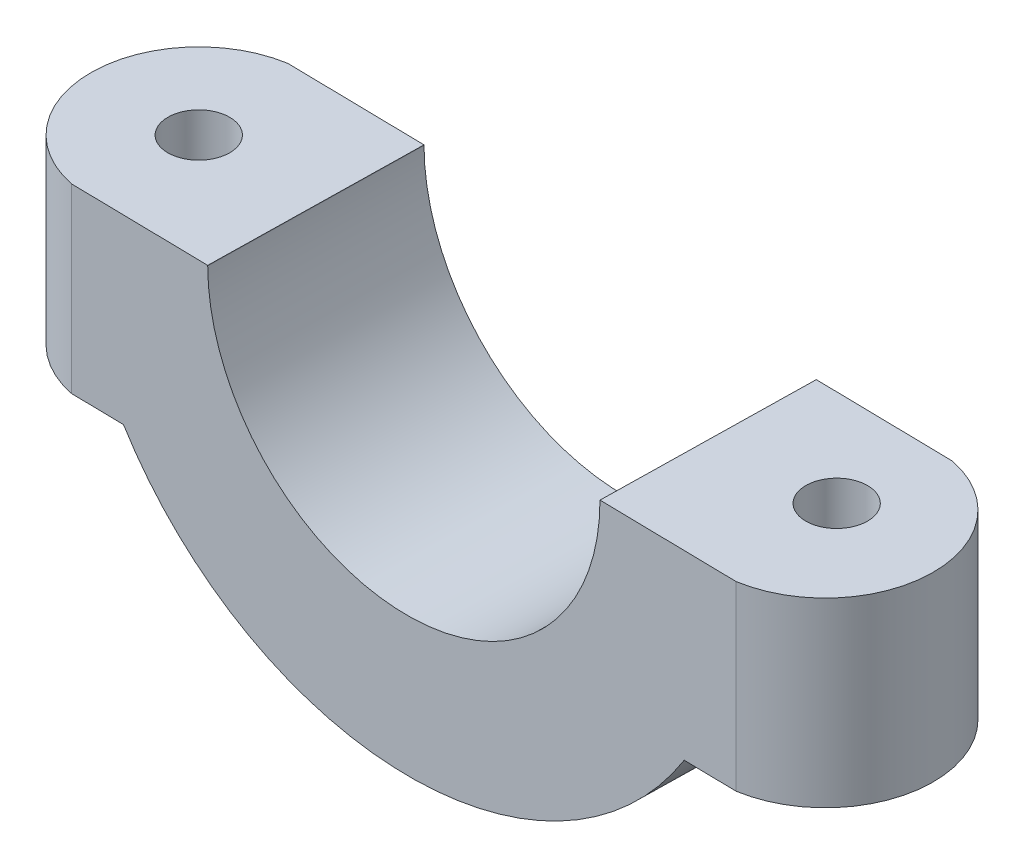
ISO-10303-21;
HEADER;
FILE_DESCRIPTION(('STEP AP214'),'2;1');
FILE_NAME('part.step','',(''),(''),'','','');
FILE_SCHEMA(('AUTOMOTIVE_DESIGN { 1 0 10303 214 1 1 1 1 }'));
ENDSEC;
DATA;
#1=APPLICATION_CONTEXT('core data for automotive mechanical design processes');
#2=APPLICATION_PROTOCOL_DEFINITION('international standard','automotive_design',2000,#1);
#3=PRODUCT_CONTEXT('',#1,'mechanical');
#4=PRODUCT('Part','Part','',(#3));
#5=PRODUCT_RELATED_PRODUCT_CATEGORY('part','',(#4));
#6=PRODUCT_DEFINITION_FORMATION('','',#4);
#7=PRODUCT_DEFINITION_CONTEXT('part definition',#1,'design');
#8=PRODUCT_DEFINITION('design','',#6,#7);
#9=PRODUCT_DEFINITION_SHAPE('','',#8);
#10=(LENGTH_UNIT() NAMED_UNIT(*) SI_UNIT(.MILLI.,.METRE.));
#11=(NAMED_UNIT(*) PLANE_ANGLE_UNIT() SI_UNIT($,.RADIAN.));
#12=(NAMED_UNIT(*) SI_UNIT($,.STERADIAN.) SOLID_ANGLE_UNIT());
#13=UNCERTAINTY_MEASURE_WITH_UNIT(LENGTH_MEASURE(1.E-05),#10,'distance_accuracy_value','');
#14=(GEOMETRIC_REPRESENTATION_CONTEXT(3) GLOBAL_UNCERTAINTY_ASSIGNED_CONTEXT((#13)) GLOBAL_UNIT_ASSIGNED_CONTEXT((#10,
#11,#12)) REPRESENTATION_CONTEXT('',''));
#15=CARTESIAN_POINT('',(0.,0.,0.));
#16=DIRECTION('',(0.,0.,1.));
#17=DIRECTION('',(1.,0.,0.));
#18=AXIS2_PLACEMENT_3D('',#15,#16,#17);
#19=CARTESIAN_POINT('',(-17.5642585339829,10.0010801024383,-0.312946842197242));
#20=DIRECTION('',(0.,-1.,0.));
#21=DIRECTION('',(0.,0.,-1.));
#22=AXIS2_PLACEMENT_3D('',#19,#20,#21);
#23=CYLINDRICAL_SURFACE('',#22,1.7);
#24=CARTESIAN_POINT('',(-17.5642585339829,10.,-0.312946842197242));
#25=DIRECTION('',(0.,1.,0.));
#26=DIRECTION('',(0.,0.,1.));
#27=AXIS2_PLACEMENT_3D('',#24,#25,#26);
#28=CIRCLE('',#27,1.7);
#29=CARTESIAN_POINT('',(-17.5642585339829,10.,1.38705315780276));
#30=VERTEX_POINT('',#29);
#31=EDGE_CURVE('E283',#30,#30,#28,.T.);
#32=ORIENTED_EDGE('',*,*,#31,.T.);
#33=EDGE_LOOP('',(#32));
#34=FACE_BOUND('',#33,.T.);
#35=CARTESIAN_POINT('',(-17.5642585339829,2.4,-0.312946842197242));
#36=DIRECTION('',(0.,-1.,0.));
#37=DIRECTION('',(0.,0.,-1.));
#38=AXIS2_PLACEMENT_3D('',#35,#36,#37);
#39=CIRCLE('',#38,1.7);
#40=CARTESIAN_POINT('',(-17.5642585339829,2.4,-2.01294684219724));
#41=VERTEX_POINT('',#40);
#42=EDGE_CURVE('E277',#41,#41,#39,.F.);
#43=ORIENTED_EDGE('',*,*,#42,.F.);
#44=EDGE_LOOP('',(#43));
#45=FACE_BOUND('',#44,.T.);
#46=ADVANCED_FACE('F35',(#34,#45),#23,.F.);
#47=CARTESIAN_POINT('',(0.851328214918512,10.,-47.5096137591291));
#48=DIRECTION('',(-0.0179161963788297,0.,0.99983949207226));
#49=DIRECTION('',(0.99983949207226,0.,0.0179161963788297));
#50=AXIS2_PLACEMENT_3D('',#47,#48,#49);
#51=CYLINDRICAL_SURFACE('',#50,18.6341563785991);
#52=CARTESIAN_POINT('',(-0.12045017804225,10.,6.72189801268763));
#53=DIRECTION('',(-0.5,0.,-0.866025403784439));
#54=DIRECTION('',(-0.866025403784439,0.,0.5));
#55=AXIS2_PLACEMENT_3D('',#52,#53,#54);
#56=ELLIPSE('',#55,21.745292275531,18.6341563785991);
#57=CARTESIAN_POINT('',(14.8142585339829,-1.35110478054826,-1.90066008246871));
#58=VERTEX_POINT('',#57);
#59=CARTESIAN_POINT('',(15.7700766746674,0.,-2.45250194328924));
#60=VERTEX_POINT('',#59);
#61=EDGE_CURVE('E281',#58,#60,#56,.F.);
#62=ORIENTED_EDGE('',*,*,#61,.F.);
#63=CARTESIAN_POINT('',(14.8142585339829,10.,-826.731322589581));
#64=DIRECTION('',(-1.,0.,0.));
#65=DIRECTION('',(0.,0.,1.));
#66=AXIS2_PLACEMENT_3D('',#63,#64,#65);
#67=ELLIPSE('',#66,1040.07323790097,18.6341563785991);
#68=CARTESIAN_POINT('',(14.8142585339829,-1.27665178885881,1.27476639807423));
#69=VERTEX_POINT('',#68);
#70=EDGE_CURVE('E11',#69,#58,#67,.F.);
#71=ORIENTED_EDGE('',*,*,#70,.F.);
#72=CARTESIAN_POINT('',(0.129084035860714,10.,-7.20372305151323));
#73=DIRECTION('',(-0.5,0.,0.866025403784438));
#74=DIRECTION('',(0.866025403784438,0.,0.500000000000001));
#75=AXIS2_PLACEMENT_3D('',#72,#73,#74);
#76=ELLIPSE('',#75,21.2999640742331,18.6341563785991);
#77=CARTESIAN_POINT('',(15.6941841409632,0.,1.78279168413117));
#78=VERTEX_POINT('',#77);
#79=EDGE_CURVE('E279',#78,#69,#76,.F.);
#80=ORIENTED_EDGE('',*,*,#79,.F.);
#81=DIRECTION('',(-0.0179161963788297,0.,0.99983949207226));
#82=VECTOR('',#81,1.);
#83=CARTESIAN_POINT('',(16.5724103974162,0.,-47.227906547219));
#84=LINE('',#83,#82);
#85=CARTESIAN_POINT('',(15.6162083568738,0.,6.13434414032025));
#86=VERTEX_POINT('',#85);
#87=EDGE_CURVE('E467',#86,#78,#84,.F.);
#88=ORIENTED_EDGE('',*,*,#87,.F.);
#89=CARTESIAN_POINT('',(-0.104873825623811,10.,5.85263692841008));
#90=DIRECTION('',(-0.0179161963788297,0.,0.99983949207226));
#91=DIRECTION('',(0.99983949207226,0.,0.0179161963788297));
#92=AXIS2_PLACEMENT_3D('',#89,#90,#91);
#93=CIRCLE('',#92,18.6341563785991);
#94=CARTESIAN_POINT('',(-15.8259560081214,0.,5.57092971649992));
#95=VERTEX_POINT('',#94);
#96=EDGE_CURVE('E370',#95,#86,#93,.T.);
#97=ORIENTED_EDGE('',*,*,#96,.F.);
#98=DIRECTION('',(-0.0179161963788297,0.,0.99983949207226));
#99=VECTOR('',#98,1.);
#100=CARTESIAN_POINT('',(-14.8697539675791,0.,-47.7913209710393));
#101=LINE('',#100,#99);
#102=CARTESIAN_POINT('',(-15.7587439972028,0.,1.82006533450991));
#103=VERTEX_POINT('',#102);
#104=EDGE_CURVE('E382',#95,#103,#101,.F.);
#105=ORIENTED_EDGE('',*,*,#104,.T.);
#106=CARTESIAN_POINT('',(0.131782855506878,10.,-7.35433462146697));
#107=DIRECTION('',(0.5,0.,0.866025403784439));
#108=DIRECTION('',(-0.866025403784439,0.,0.5));
#109=AXIS2_PLACEMENT_3D('',#106,#107,#108);
#110=ELLIPSE('',#109,21.745292275531,18.6341563785991);
#111=CARTESIAN_POINT('',(-14.8142585339829,-1.3364909772252,1.27476639807423));
#112=VERTEX_POINT('',#111);
#113=EDGE_CURVE('E276',#112,#103,#110,.F.);
#114=ORIENTED_EDGE('',*,*,#113,.F.);
#115=CARTESIAN_POINT('',(-14.8142585339829,10.,826.731322589581));
#116=DIRECTION('',(1.,0.,0.));
#117=DIRECTION('',(0.,0.,1.));
#118=AXIS2_PLACEMENT_3D('',#115,#116,#117);
#119=ELLIPSE('',#118,1040.07323790097,18.6341563785991);
#120=CARTESIAN_POINT('',(-14.8142585339829,-1.26188472603565,-1.90066008246871));
#121=VERTEX_POINT('',#120);
#122=EDGE_CURVE('E43',#121,#112,#119,.F.);
#123=ORIENTED_EDGE('',*,*,#122,.F.);
#124=CARTESIAN_POINT('',(-0.117983443612844,10.,6.58423829704122));
#125=DIRECTION('',(0.5,0.,-0.866025403784438));
#126=DIRECTION('',(0.866025403784439,0.,0.5));
#127=AXIS2_PLACEMENT_3D('',#124,#125,#126);
#128=ELLIPSE('',#127,21.2999640742331,18.6341563785991);
#129=CARTESIAN_POINT('',(-15.6830835487153,0.,-2.40227643860318));
#130=VERTEX_POINT('',#129);
#131=EDGE_CURVE('E274',#130,#121,#128,.F.);
#132=ORIENTED_EDGE('',*,*,#131,.F.);
#133=CARTESIAN_POINT('',(-15.6162724285387,0.,-6.13076852753603));
#134=VERTEX_POINT('',#133);
#135=EDGE_CURVE('E463',#130,#134,#101,.F.);
#136=ORIENTED_EDGE('',*,*,#135,.T.);
#137=CARTESIAN_POINT('',(0.104809753958984,10.,-5.84906131562587));
#138=DIRECTION('',(-0.0179161963788298,0.,0.99983949207226));
#139=DIRECTION('',(0.99983949207226,0.,0.0179161963788298));
#140=AXIS2_PLACEMENT_3D('',#137,#138,#139);
#141=CIRCLE('',#140,18.6341563785991);
#142=CARTESIAN_POINT('',(15.8258919364566,0.,-5.56735410371571));
#143=VERTEX_POINT('',#142);
#144=EDGE_CURVE('E487',#143,#134,#141,.F.);
#145=ORIENTED_EDGE('',*,*,#144,.F.);
#146=EDGE_CURVE('E469',#60,#143,#84,.F.);
#147=ORIENTED_EDGE('',*,*,#146,.F.);
#148=EDGE_LOOP('',(#62,#71,#80,#88,#97,#105,#114,#123,#132,#136,#145,#147));
#149=FACE_BOUND('',#148,.T.);
#150=ADVANCED_FACE('F457',(#149),#51,.T.);
#151=CARTESIAN_POINT('',(0.851328214918512,10.,-47.5096137591291));
#152=DIRECTION('',(-0.0179161963788297,0.,0.99983949207226));
#153=DIRECTION('',(0.99983949207226,0.,0.0179161963788297));
#154=AXIS2_PLACEMENT_3D('',#151,#152,#153);
#155=CYLINDRICAL_SURFACE('',#154,11.);
#156=CARTESIAN_POINT('',(0.104809753958984,10.,-5.84906131562587));
#157=DIRECTION('',(-0.0179161963788298,0.,0.99983949207226));
#158=DIRECTION('',(0.99983949207226,0.,0.0179161963788298));
#159=AXIS2_PLACEMENT_3D('',#156,#157,#158);
#160=CIRCLE('',#159,11.);
#161=CARTESIAN_POINT('',(-10.8933926230034,9.97345003897609,-6.04613890174059));
#162=VERTEX_POINT('',#161);
#163=CARTESIAN_POINT('',(11.1030441667539,10.,-5.65198315545875));
#164=VERTEX_POINT('',#163);
#165=EDGE_CURVE('E343',#162,#164,#160,.T.);
#166=ORIENTED_EDGE('',*,*,#165,.F.);
#167=DIRECTION('',(-0.0179161963788297,0.,0.99983949207226));
#168=VECTOR('',#167,1.);
#169=CARTESIAN_POINT('',(-10.1468741620439,9.97345003897252,-47.7066913452438));
#170=LINE('',#169,#168);
#171=CARTESIAN_POINT('',(-11.1030762025862,9.97345003897252,5.65555934229536));
#172=VERTEX_POINT('',#171);
#173=EDGE_CURVE('E356',#162,#172,#170,.T.);
#174=ORIENTED_EDGE('',*,*,#173,.T.);
#175=CARTESIAN_POINT('',(-0.104873825623811,10.,5.85263692841008));
#176=DIRECTION('',(0.0179161963788297,0.,-0.99983949207226));
#177=DIRECTION('',(0.99983949207226,0.,0.0179161963788297));
#178=AXIS2_PLACEMENT_3D('',#175,#176,#177);
#179=CIRCLE('',#178,11.);
#180=CARTESIAN_POINT('',(10.8933605871711,10.,6.04971508857721));
#181=VERTEX_POINT('',#180);
#182=EDGE_CURVE('E364',#181,#172,#179,.T.);
#183=ORIENTED_EDGE('',*,*,#182,.F.);
#184=DIRECTION('',(-0.0179161963788297,0.,0.99983949207226));
#185=VECTOR('',#184,1.);
#186=CARTESIAN_POINT('',(11.8495626277134,10.,-47.312535598962));
#187=LINE('',#186,#185);
#188=EDGE_CURVE('E372',#164,#181,#187,.T.);
#189=ORIENTED_EDGE('',*,*,#188,.F.);
#190=EDGE_LOOP('',(#166,#174,#183,#189));
#191=FACE_BOUND('',#190,.T.);
#192=ADVANCED_FACE('F499',(#191),#155,.F.);
#193=CARTESIAN_POINT('',(17.5642585339831,10.,0.316523603086257));
#194=DIRECTION('',(0.,-1.,0.));
#195=DIRECTION('',(0.,0.,-1.));
#196=AXIS2_PLACEMENT_3D('',#193,#194,#195);
#197=CYLINDRICAL_SURFACE('',#196,5.94828404765475);
#198=CARTESIAN_POINT('',(17.5642585339831,0.,0.316523603086257));
#199=DIRECTION('',(0.,1.,0.));
#200=DIRECTION('',(0.,0.,1.));
#201=AXIS2_PLACEMENT_3D('',#198,#199,#200);
#202=CIRCLE('',#201,5.94828404765475);
#203=CARTESIAN_POINT('',(18.5263236589823,0.,6.18649070749529));
#204=VERTEX_POINT('',#203);
#205=CARTESIAN_POINT('',(18.7360072385651,0.,-5.51520753654067));
#206=VERTEX_POINT('',#205);
#207=EDGE_CURVE('E484',#204,#206,#202,.T.);
#208=ORIENTED_EDGE('',*,*,#207,.T.);
#209=DIRECTION('',(0.,-1.,0.));
#210=VECTOR('',#209,1.);
#211=CARTESIAN_POINT('',(18.7360072385651,10.,-5.51520753654067));
#212=LINE('',#211,#210);
#213=CARTESIAN_POINT('',(18.7360072385651,10.,-5.51520753654067));
#214=VERTEX_POINT('',#213);
#215=EDGE_CURVE('E472',#214,#206,#212,.T.);
#216=ORIENTED_EDGE('',*,*,#215,.F.);
#217=CARTESIAN_POINT('',(17.5642585339831,10.,0.316523603086257));
#218=DIRECTION('',(0.,1.,0.));
#219=DIRECTION('',(0.,0.,1.));
#220=AXIS2_PLACEMENT_3D('',#217,#218,#219);
#221=CIRCLE('',#220,5.94828404765475);
#222=CARTESIAN_POINT('',(18.5263236589823,10.,6.18649070749529));
#223=VERTEX_POINT('',#222);
#224=EDGE_CURVE('E480',#223,#214,#221,.T.);
#225=ORIENTED_EDGE('',*,*,#224,.F.);
#226=DIRECTION('',(0.,-1.,0.));
#227=VECTOR('',#226,1.);
#228=CARTESIAN_POINT('',(18.5263236589823,10.,6.18649070749529));
#229=LINE('',#228,#227);
#230=EDGE_CURVE('E475',#223,#204,#229,.T.);
#231=ORIENTED_EDGE('',*,*,#230,.T.);
#232=EDGE_LOOP('',(#208,#216,#225,#231));
#233=FACE_BOUND('',#232,.T.);
#234=ADVANCED_FACE('F37',(#233),#197,.T.);
#235=CARTESIAN_POINT('',(18.7360072385651,10.,-5.51520753654067));
#236=DIRECTION('',(-0.0179161963788298,0.,0.99983949207226));
#237=DIRECTION('',(0.99983949207226,0.,0.0179161963788298));
#238=AXIS2_PLACEMENT_3D('',#235,#236,#237);
#239=PLANE('',#238);
#240=DIRECTION('',(0.,-1.,0.));
#241=VECTOR('',#240,1.);
#242=CARTESIAN_POINT('',(-10.8933926230034,10.,-6.0461389017406));
#243=LINE('',#242,#241);
#244=CARTESIAN_POINT('',(-10.8933926230034,10.,-6.0461389017406));
#245=VERTEX_POINT('',#244);
#246=EDGE_CURVE('E342',#245,#162,#243,.T.);
#247=ORIENTED_EDGE('',*,*,#246,.T.);
#248=ORIENTED_EDGE('',*,*,#165,.T.);
#249=DIRECTION('',(-0.99983949207226,0.,-0.0179161963788298));
#250=VECTOR('',#249,1.);
#251=CARTESIAN_POINT('',(18.7360072385651,10.,-5.51520753654067));
#252=LINE('',#251,#250);
#253=EDGE_CURVE('E489',#214,#164,#252,.T.);
#254=ORIENTED_EDGE('',*,*,#253,.F.);
#255=ORIENTED_EDGE('',*,*,#215,.T.);
#256=DIRECTION('',(-0.99983949207226,0.,-0.0179161963788298));
#257=VECTOR('',#256,1.);
#258=CARTESIAN_POINT('',(18.7360072385651,0.,-5.51520753654067));
#259=LINE('',#258,#257);
#260=EDGE_CURVE('E481',#206,#143,#259,.T.);
#261=ORIENTED_EDGE('',*,*,#260,.T.);
#262=ORIENTED_EDGE('',*,*,#144,.T.);
#263=DIRECTION('',(-0.99983949207226,0.,-0.0179161963788298));
#264=VECTOR('',#263,1.);
#265=CARTESIAN_POINT('',(-10.8933926230034,0.,-6.0461389017406));
#266=LINE('',#265,#264);
#267=CARTESIAN_POINT('',(-18.5263236589821,0.,-6.18291394660628));
#268=VERTEX_POINT('',#267);
#269=EDGE_CURVE('E299',#134,#268,#266,.T.);
#270=ORIENTED_EDGE('',*,*,#269,.T.);
#271=DIRECTION('',(0.,-1.,0.));
#272=VECTOR('',#271,1.);
#273=CARTESIAN_POINT('',(-18.5263236589821,10.,-6.18291394660628));
#274=LINE('',#273,#272);
#275=CARTESIAN_POINT('',(-18.5263236589821,9.96544407338109,-6.18291394660628));
#276=VERTEX_POINT('',#275);
#277=EDGE_CURVE('E334',#276,#268,#274,.T.);
#278=ORIENTED_EDGE('',*,*,#277,.F.);
#279=CARTESIAN_POINT('',(-18.5263236589821,9.96544407338109,-6.18291394660628));
#280=DIRECTION('',(0.,1.,0.));
#281=VECTOR('',#280,1.);
#282=LINE('',#279,#281);
#283=CARTESIAN_POINT('',(-18.5263397292386,10.,-6.18291131270761));
#284=VERTEX_POINT('',#283);
#285=EDGE_CURVE('E498',#276,#284,#282,.T.);
#286=ORIENTED_EDGE('',*,*,#285,.T.);
#287=DIRECTION('',(0.99983949207226,0.,0.0179161963788298));
#288=VECTOR('',#287,1.);
#289=CARTESIAN_POINT('',(-10.8934246588359,10.,-6.046139475793));
#290=LINE('',#289,#288);
#291=EDGE_CURVE('E389',#284,#245,#290,.T.);
#292=ORIENTED_EDGE('',*,*,#291,.T.);
#293=EDGE_LOOP('',(#247,#248,#254,#255,#261,#262,#270,#278,#286,#292));
#294=FACE_BOUND('',#293,.T.);
#295=ADVANCED_FACE('F400',(#294),#239,.F.);
#296=CARTESIAN_POINT('',(10.8933926230035,10.,6.04971566262962));
#297=DIRECTION('',(0.0179161963788297,0.,-0.99983949207226));
#298=DIRECTION('',(-0.99983949207226,0.,-0.0179161963788297));
#299=AXIS2_PLACEMENT_3D('',#296,#297,#298);
#300=PLANE('',#299);
#301=ORIENTED_EDGE('',*,*,#182,.T.);
#302=DIRECTION('',(0.,-1.,0.));
#303=VECTOR('',#302,1.);
#304=CARTESIAN_POINT('',(-11.1030762025862,10.,5.65555934229536));
#305=LINE('',#304,#303);
#306=CARTESIAN_POINT('',(-11.1030762025862,10.,5.65555934229536));
#307=VERTEX_POINT('',#306);
#308=EDGE_CURVE('E300',#307,#172,#305,.T.);
#309=ORIENTED_EDGE('',*,*,#308,.F.);
#310=DIRECTION('',(-0.99983949207226,0.,-0.0179161963788297));
#311=VECTOR('',#310,1.);
#312=CARTESIAN_POINT('',(-11.1031082384187,10.,5.65555876824296));
#313=LINE('',#312,#311);
#314=CARTESIAN_POINT('',(-18.736022690319,10.,5.51878119272186));
#315=VERTEX_POINT('',#314);
#316=EDGE_CURVE('E362',#307,#315,#313,.T.);
#317=ORIENTED_EDGE('',*,*,#316,.T.);
#318=CARTESIAN_POINT('',(-18.7360072385649,10.,5.51878429742968));
#319=DIRECTION('',(0.,-1.,0.));
#320=VECTOR('',#319,1.);
#321=LINE('',#318,#320);
#322=CARTESIAN_POINT('',(-18.7360072385649,9.96544407338501,5.51878429742969));
#323=VERTEX_POINT('',#322);
#324=EDGE_CURVE('E304',#315,#323,#321,.T.);
#325=ORIENTED_EDGE('',*,*,#324,.T.);
#326=DIRECTION('',(0.,-1.,0.));
#327=VECTOR('',#326,1.);
#328=CARTESIAN_POINT('',(-18.7360072385649,10.,5.51878429742968));
#329=LINE('',#328,#327);
#330=CARTESIAN_POINT('',(-18.7360072385649,0.,5.51878429742968));
#331=VERTEX_POINT('',#330);
#332=EDGE_CURVE('E302',#323,#331,#329,.T.);
#333=ORIENTED_EDGE('',*,*,#332,.T.);
#334=DIRECTION('',(0.99983949207226,0.,0.0179161963788302));
#335=VECTOR('',#334,1.);
#336=CARTESIAN_POINT('',(-18.7360072385649,0.,5.51878429742968));
#337=LINE('',#336,#335);
#338=EDGE_CURVE('E537',#331,#95,#337,.T.);
#339=ORIENTED_EDGE('',*,*,#338,.T.);
#340=ORIENTED_EDGE('',*,*,#96,.T.);
#341=DIRECTION('',(0.99983949207226,0.,0.0179161963788297));
#342=VECTOR('',#341,1.);
#343=CARTESIAN_POINT('',(10.8933926230035,0.,6.04971566262962));
#344=LINE('',#343,#342);
#345=EDGE_CURVE('E478',#86,#204,#344,.T.);
#346=ORIENTED_EDGE('',*,*,#345,.T.);
#347=ORIENTED_EDGE('',*,*,#230,.F.);
#348=DIRECTION('',(0.99983949207226,0.,0.0179161963788297));
#349=VECTOR('',#348,1.);
#350=CARTESIAN_POINT('',(10.8933926230035,10.,6.04971566262962));
#351=LINE('',#350,#349);
#352=EDGE_CURVE('E366',#181,#223,#351,.T.);
#353=ORIENTED_EDGE('',*,*,#352,.F.);
#354=EDGE_LOOP('',(#301,#309,#317,#325,#333,#339,#340,#346,#347,#353));
#355=FACE_BOUND('',#354,.T.);
#356=ADVANCED_FACE('F361',(#355),#300,.F.);
#357=CARTESIAN_POINT('',(17.5642585339831,10.,0.316523603086257));
#358=DIRECTION('',(0.,1.,0.));
#359=DIRECTION('',(0.,0.,1.));
#360=AXIS2_PLACEMENT_3D('',#357,#358,#359);
#361=PLANE('',#360);
#362=CARTESIAN_POINT('',(17.5642585339829,10.,-0.312946842197237));
#363=DIRECTION('',(0.,1.,0.));
#364=DIRECTION('',(0.,0.,1.));
#365=AXIS2_PLACEMENT_3D('',#362,#363,#364);
#366=CIRCLE('',#365,1.7);
#367=CARTESIAN_POINT('',(17.5642585339829,10.,1.38705315780276));
#368=VERTEX_POINT('',#367);
#369=EDGE_CURVE('E286',#368,#368,#366,.T.);
#370=ORIENTED_EDGE('',*,*,#369,.F.);
#371=EDGE_LOOP('',(#370));
#372=FACE_BOUND('',#371,.T.);
#373=ORIENTED_EDGE('',*,*,#253,.T.);
#374=ORIENTED_EDGE('',*,*,#188,.T.);
#375=ORIENTED_EDGE('',*,*,#352,.T.);
#376=ORIENTED_EDGE('',*,*,#224,.T.);
#377=EDGE_LOOP('',(#373,#374,#375,#376));
#378=FACE_BOUND('',#377,.T.);
#379=ADVANCED_FACE('F399',(#372,#378),#361,.T.);
#380=CARTESIAN_POINT('',(17.5642585339831,0.,0.316523603086257));
#381=DIRECTION('',(0.,1.,0.));
#382=DIRECTION('',(0.,0.,1.));
#383=AXIS2_PLACEMENT_3D('',#380,#381,#382);
#384=PLANE('',#383);
#385=DIRECTION('',(-0.866025403784439,0.,-0.5));
#386=VECTOR('',#385,1.);
#387=CARTESIAN_POINT('',(19.2118272322565,0.,-2.53714909128347));
#388=LINE('',#387,#386);
#389=CARTESIAN_POINT('',(20.3142585339829,0.,-1.90066008246871));
#390=VERTEX_POINT('',#389);
#391=CARTESIAN_POINT('',(17.5642585339829,0.,-3.48837332274018));
#392=VERTEX_POINT('',#391);
#393=EDGE_CURVE('E440',#390,#392,#388,.T.);
#394=ORIENTED_EDGE('',*,*,#393,.T.);
#395=DIRECTION('',(-0.866025403784439,0.,0.5));
#396=VECTOR('',#395,1.);
#397=CARTESIAN_POINT('',(15.9166898357095,0.,-2.53714909128366));
#398=LINE('',#397,#396);
#399=EDGE_CURVE('E443',#392,#60,#398,.T.);
#400=ORIENTED_EDGE('',*,*,#399,.T.);
#401=ORIENTED_EDGE('',*,*,#146,.T.);
#402=ORIENTED_EDGE('',*,*,#260,.F.);
#403=ORIENTED_EDGE('',*,*,#207,.F.);
#404=ORIENTED_EDGE('',*,*,#345,.F.);
#405=ORIENTED_EDGE('',*,*,#87,.T.);
#406=DIRECTION('',(0.866025403784438,0.,0.500000000000001));
#407=VECTOR('',#406,1.);
#408=CARTESIAN_POINT('',(16.4618272322565,0.,2.22599062953093));
#409=LINE('',#408,#407);
#410=CARTESIAN_POINT('',(17.5642585339829,0.,2.8624796383457));
#411=VERTEX_POINT('',#410);
#412=EDGE_CURVE('E436',#78,#411,#409,.T.);
#413=ORIENTED_EDGE('',*,*,#412,.T.);
#414=DIRECTION('',(0.866025403784439,0.,-0.5));
#415=VECTOR('',#414,1.);
#416=CARTESIAN_POINT('',(18.6666898357095,0.,2.22599062953074));
#417=LINE('',#416,#415);
#418=CARTESIAN_POINT('',(20.3142585339829,0.,1.27476639807423));
#419=VERTEX_POINT('',#418);
#420=EDGE_CURVE('E434',#411,#419,#417,.T.);
#421=ORIENTED_EDGE('',*,*,#420,.T.);
#422=DIRECTION('',(0.,0.,-1.));
#423=VECTOR('',#422,1.);
#424=CARTESIAN_POINT('',(20.3142585339829,0.,0.316523603086263));
#425=LINE('',#424,#423);
#426=EDGE_CURVE('E200',#419,#390,#425,.T.);
#427=ORIENTED_EDGE('',*,*,#426,.T.);
#428=EDGE_LOOP('',(#394,#400,#401,#402,#403,#404,#405,#413,#421,#427));
#429=FACE_BOUND('',#428,.T.);
#430=ADVANCED_FACE('F401',(#429),#384,.F.);
#431=CARTESIAN_POINT('',(-10.1469061978764,10.,-47.7066919192962));
#432=DIRECTION('',(0.,1.,0.));
#433=DIRECTION('',(0.,0.,1.));
#434=AXIS2_PLACEMENT_3D('',#431,#432,#433);
#435=PLANE('',#434);
#436=ORIENTED_EDGE('',*,*,#31,.F.);
#437=EDGE_LOOP('',(#436));
#438=FACE_BOUND('',#437,.T.);
#439=ORIENTED_EDGE('',*,*,#291,.F.);
#440=CARTESIAN_POINT('',(-17.5642585339829,10.,-0.312946842197242));
#441=DIRECTION('',(0.,1.,0.));
#442=DIRECTION('',(0.,0.,1.));
#443=AXIS2_PLACEMENT_3D('',#440,#441,#442);
#444=CIRCLE('',#443,5.94828404765475);
#445=EDGE_CURVE('E295',#284,#315,#444,.T.);
#446=ORIENTED_EDGE('',*,*,#445,.T.);
#447=ORIENTED_EDGE('',*,*,#316,.F.);
#448=DIRECTION('',(0.0179161963788299,0.,-0.99983949207226));
#449=VECTOR('',#448,1.);
#450=CARTESIAN_POINT('',(-11.1030762025862,10.,5.65555934229536));
#451=LINE('',#450,#449);
#452=EDGE_CURVE('E292',#307,#245,#451,.T.);
#453=ORIENTED_EDGE('',*,*,#452,.T.);
#454=EDGE_LOOP('',(#439,#446,#447,#453));
#455=FACE_BOUND('',#454,.T.);
#456=ADVANCED_FACE('F328',(#438,#455),#435,.T.);
#457=CARTESIAN_POINT('',(-11.1030762025862,10.,5.65555934229536));
#458=DIRECTION('',(-0.99983949207226,0.,-0.0179161963788299));
#459=DIRECTION('',(-0.0179161963788299,0.,0.99983949207226));
#460=AXIS2_PLACEMENT_3D('',#457,#458,#459);
#461=PLANE('',#460);
#462=ORIENTED_EDGE('',*,*,#173,.F.);
#463=ORIENTED_EDGE('',*,*,#246,.F.);
#464=ORIENTED_EDGE('',*,*,#452,.F.);
#465=ORIENTED_EDGE('',*,*,#308,.T.);
#466=EDGE_LOOP('',(#462,#463,#464,#465));
#467=FACE_BOUND('',#466,.T.);
#468=ADVANCED_FACE('F326',(#467),#461,.F.);
#469=CARTESIAN_POINT('',(-17.5642585339829,10.,-0.312946842197242));
#470=DIRECTION('',(0.,-1.,0.));
#471=DIRECTION('',(0.,0.,-1.));
#472=AXIS2_PLACEMENT_3D('',#469,#470,#471);
#473=CYLINDRICAL_SURFACE('',#472,5.94828404765475);
#474=ORIENTED_EDGE('',*,*,#285,.F.);
#475=ORIENTED_EDGE('',*,*,#277,.T.);
#476=CARTESIAN_POINT('',(-17.5642585339829,0.,-0.312946842197242));
#477=DIRECTION('',(0.,1.,0.));
#478=DIRECTION('',(0.,0.,1.));
#479=AXIS2_PLACEMENT_3D('',#476,#477,#478);
#480=CIRCLE('',#479,5.94828404765475);
#481=EDGE_CURVE('E289',#268,#331,#480,.T.);
#482=ORIENTED_EDGE('',*,*,#481,.T.);
#483=ORIENTED_EDGE('',*,*,#332,.F.);
#484=ORIENTED_EDGE('',*,*,#324,.F.);
#485=ORIENTED_EDGE('',*,*,#445,.F.);
#486=EDGE_LOOP('',(#474,#475,#482,#483,#484,#485));
#487=FACE_BOUND('',#486,.T.);
#488=ADVANCED_FACE('F315',(#487),#473,.T.);
#489=CARTESIAN_POINT('',(-17.5642585339829,0.,-0.312946842197242));
#490=DIRECTION('',(0.,1.,0.));
#491=DIRECTION('',(0.,0.,1.));
#492=AXIS2_PLACEMENT_3D('',#489,#490,#491);
#493=PLANE('',#492);
#494=DIRECTION('',(0.866025403784439,0.,0.5));
#495=VECTOR('',#494,1.);
#496=CARTESIAN_POINT('',(-18.9392585339829,0.,2.06862301820996));
#497=LINE('',#496,#495);
#498=CARTESIAN_POINT('',(-20.3142585339829,0.,1.27476639807423));
#499=VERTEX_POINT('',#498);
#500=CARTESIAN_POINT('',(-17.5642585339829,0.,2.8624796383457));
#501=VERTEX_POINT('',#500);
#502=EDGE_CURVE('E428',#499,#501,#497,.T.);
#503=ORIENTED_EDGE('',*,*,#502,.T.);
#504=DIRECTION('',(0.866025403784439,0.,-0.5));
#505=VECTOR('',#504,1.);
#506=CARTESIAN_POINT('',(-16.1892585339829,0.,2.06862301820996));
#507=LINE('',#506,#505);
#508=EDGE_CURVE('E431',#501,#103,#507,.T.);
#509=ORIENTED_EDGE('',*,*,#508,.T.);
#510=ORIENTED_EDGE('',*,*,#104,.F.);
#511=ORIENTED_EDGE('',*,*,#338,.F.);
#512=ORIENTED_EDGE('',*,*,#481,.F.);
#513=ORIENTED_EDGE('',*,*,#269,.F.);
#514=ORIENTED_EDGE('',*,*,#135,.F.);
#515=DIRECTION('',(-0.866025403784439,0.,-0.5));
#516=VECTOR('',#515,1.);
#517=CARTESIAN_POINT('',(-16.1892585339829,0.,-2.69451670260445));
#518=LINE('',#517,#516);
#519=CARTESIAN_POINT('',(-17.5642585339829,0.,-3.48837332274018));
#520=VERTEX_POINT('',#519);
#521=EDGE_CURVE('E419',#130,#520,#518,.T.);
#522=ORIENTED_EDGE('',*,*,#521,.T.);
#523=DIRECTION('',(-0.866025403784439,0.,0.5));
#524=VECTOR('',#523,1.);
#525=CARTESIAN_POINT('',(-18.9392585339829,0.,-2.69451670260445));
#526=LINE('',#525,#524);
#527=CARTESIAN_POINT('',(-20.3142585339829,0.,-1.90066008246871));
#528=VERTEX_POINT('',#527);
#529=EDGE_CURVE('E422',#520,#528,#526,.T.);
#530=ORIENTED_EDGE('',*,*,#529,.T.);
#531=DIRECTION('',(0.,0.,1.));
#532=VECTOR('',#531,1.);
#533=CARTESIAN_POINT('',(-20.3142585339829,0.,-0.312946842197242));
#534=LINE('',#533,#532);
#535=EDGE_CURVE('E425',#528,#499,#534,.T.);
#536=ORIENTED_EDGE('',*,*,#535,.T.);
#537=EDGE_LOOP('',(#503,#509,#510,#511,#512,#513,#514,#522,#530,#536));
#538=FACE_BOUND('',#537,.T.);
#539=ADVANCED_FACE('F325',(#538),#493,.F.);
#540=CARTESIAN_POINT('',(17.5642585339829,10.0010801024383,-0.312946842197237));
#541=DIRECTION('',(0.,-1.,0.));
#542=DIRECTION('',(0.,0.,-1.));
#543=AXIS2_PLACEMENT_3D('',#540,#541,#542);
#544=CYLINDRICAL_SURFACE('',#543,1.7);
#545=CARTESIAN_POINT('',(17.5642585339829,2.4,-0.312946842197237));
#546=DIRECTION('',(0.,1.,0.));
#547=DIRECTION('',(0.,0.,1.));
#548=AXIS2_PLACEMENT_3D('',#545,#546,#547);
#549=CIRCLE('',#548,1.7);
#550=CARTESIAN_POINT('',(17.5642585339829,2.4,1.38705315780276));
#551=VERTEX_POINT('',#550);
#552=EDGE_CURVE('E233',#551,#551,#549,.F.);
#553=ORIENTED_EDGE('',*,*,#552,.T.);
#554=EDGE_LOOP('',(#553));
#555=FACE_BOUND('',#554,.T.);
#556=ORIENTED_EDGE('',*,*,#369,.T.);
#557=EDGE_LOOP('',(#556));
#558=FACE_BOUND('',#557,.T.);
#559=ADVANCED_FACE('F516',(#555,#558),#544,.F.);
#560=CARTESIAN_POINT('',(20.3142585339829,2.4,1.27476639807423));
#561=DIRECTION('',(1.,0.,0.));
#562=DIRECTION('',(0.,0.,-1.));
#563=AXIS2_PLACEMENT_3D('',#560,#561,#562);
#564=PLANE('',#563);
#565=DIRECTION('',(0.,-1.,0.));
#566=VECTOR('',#565,1.);
#567=CARTESIAN_POINT('',(20.3142585339829,2.4,1.27476639807423));
#568=LINE('',#567,#566);
#569=CARTESIAN_POINT('',(20.3142585339829,2.4,1.27476639807423));
#570=VERTEX_POINT('',#569);
#571=EDGE_CURVE('E50',#570,#419,#568,.T.);
#572=ORIENTED_EDGE('',*,*,#571,.F.);
#573=DIRECTION('',(0.,0.,1.));
#574=VECTOR('',#573,1.);
#575=CARTESIAN_POINT('',(20.3142585339829,2.4,1.27476639807423));
#576=LINE('',#575,#574);
#577=CARTESIAN_POINT('',(20.3142585339829,2.4,-1.90066008246871));
#578=VERTEX_POINT('',#577);
#579=EDGE_CURVE('E197',#578,#570,#576,.T.);
#580=ORIENTED_EDGE('',*,*,#579,.F.);
#581=DIRECTION('',(0.,-1.,0.));
#582=VECTOR('',#581,1.);
#583=CARTESIAN_POINT('',(20.3142585339829,2.4,-1.90066008246871));
#584=LINE('',#583,#582);
#585=EDGE_CURVE('E231',#578,#390,#584,.T.);
#586=ORIENTED_EDGE('',*,*,#585,.T.);
#587=ORIENTED_EDGE('',*,*,#426,.F.);
#588=EDGE_LOOP('',(#572,#580,#586,#587));
#589=FACE_BOUND('',#588,.T.);
#590=ADVANCED_FACE('F194',(#589),#564,.F.);
#591=CARTESIAN_POINT('',(20.3142585339829,2.4,-1.90066008246871));
#592=DIRECTION('',(0.5,0.,-0.866025403784439));
#593=DIRECTION('',(-0.866025403784439,0.,-0.5));
#594=AXIS2_PLACEMENT_3D('',#591,#592,#593);
#595=PLANE('',#594);
#596=ORIENTED_EDGE('',*,*,#585,.F.);
#597=DIRECTION('',(0.866025403784439,0.,0.5));
#598=VECTOR('',#597,1.);
#599=CARTESIAN_POINT('',(20.3142585339829,2.4,-1.90066008246871));
#600=LINE('',#599,#598);
#601=CARTESIAN_POINT('',(17.5642585339829,2.4,-3.48837332274018));
#602=VERTEX_POINT('',#601);
#603=EDGE_CURVE('E203',#602,#578,#600,.T.);
#604=ORIENTED_EDGE('',*,*,#603,.F.);
#605=DIRECTION('',(0.,-1.,0.));
#606=VECTOR('',#605,1.);
#607=CARTESIAN_POINT('',(17.5642585339829,2.4,-3.48837332274018));
#608=LINE('',#607,#606);
#609=EDGE_CURVE('E234',#602,#392,#608,.T.);
#610=ORIENTED_EDGE('',*,*,#609,.T.);
#611=ORIENTED_EDGE('',*,*,#393,.F.);
#612=EDGE_LOOP('',(#596,#604,#610,#611));
#613=FACE_BOUND('',#612,.T.);
#614=ADVANCED_FACE('F555',(#613),#595,.F.);
#615=CARTESIAN_POINT('',(17.5642585339829,2.4,2.8624796383457));
#616=DIRECTION('',(0.5,0.,0.866025403784439));
#617=DIRECTION('',(0.866025403784439,0.,-0.5));
#618=AXIS2_PLACEMENT_3D('',#615,#616,#617);
#619=PLANE('',#618);
#620=DIRECTION('',(0.,-1.,0.));
#621=VECTOR('',#620,1.);
#622=CARTESIAN_POINT('',(17.5642585339829,2.4,2.8624796383457));
#623=LINE('',#622,#621);
#624=CARTESIAN_POINT('',(17.5642585339829,2.4,2.8624796383457));
#625=VERTEX_POINT('',#624);
#626=EDGE_CURVE('E202',#625,#411,#623,.T.);
#627=ORIENTED_EDGE('',*,*,#626,.F.);
#628=DIRECTION('',(-0.866025403784439,0.,0.5));
#629=VECTOR('',#628,1.);
#630=CARTESIAN_POINT('',(17.5642585339829,2.4,2.8624796383457));
#631=LINE('',#630,#629);
#632=EDGE_CURVE('E206',#570,#625,#631,.T.);
#633=ORIENTED_EDGE('',*,*,#632,.F.);
#634=ORIENTED_EDGE('',*,*,#571,.T.);
#635=ORIENTED_EDGE('',*,*,#420,.F.);
#636=EDGE_LOOP('',(#627,#633,#634,#635));
#637=FACE_BOUND('',#636,.T.);
#638=ADVANCED_FACE('F207',(#637),#619,.F.);
#639=CARTESIAN_POINT('',(0.,2.4,0.));
#640=DIRECTION('',(0.,1.,0.));
#641=DIRECTION('',(0.,0.,1.));
#642=AXIS2_PLACEMENT_3D('',#639,#640,#641);
#643=PLANE('',#642);
#644=ORIENTED_EDGE('',*,*,#579,.T.);
#645=ORIENTED_EDGE('',*,*,#632,.T.);
#646=DIRECTION('',(-0.866025403784438,0.,-0.500000000000001));
#647=VECTOR('',#646,1.);
#648=CARTESIAN_POINT('',(14.8142585339829,2.4,1.27476639807423));
#649=LINE('',#648,#647);
#650=CARTESIAN_POINT('',(14.8142585339829,2.4,1.27476639807423));
#651=VERTEX_POINT('',#650);
#652=EDGE_CURVE('E212',#625,#651,#649,.T.);
#653=ORIENTED_EDGE('',*,*,#652,.T.);
#654=DIRECTION('',(0.,0.,-1.));
#655=VECTOR('',#654,1.);
#656=CARTESIAN_POINT('',(14.8142585339829,2.4,-1.90066008246871));
#657=LINE('',#656,#655);
#658=CARTESIAN_POINT('',(14.8142585339829,2.4,-1.90066008246871));
#659=VERTEX_POINT('',#658);
#660=EDGE_CURVE('E225',#651,#659,#657,.T.);
#661=ORIENTED_EDGE('',*,*,#660,.T.);
#662=DIRECTION('',(0.866025403784439,0.,-0.5));
#663=VECTOR('',#662,1.);
#664=CARTESIAN_POINT('',(17.5642585339829,2.4,-3.48837332274018));
#665=LINE('',#664,#663);
#666=EDGE_CURVE('E228',#659,#602,#665,.T.);
#667=ORIENTED_EDGE('',*,*,#666,.T.);
#668=ORIENTED_EDGE('',*,*,#603,.T.);
#669=EDGE_LOOP('',(#644,#645,#653,#661,#667,#668));
#670=FACE_BOUND('',#669,.T.);
#671=ORIENTED_EDGE('',*,*,#552,.F.);
#672=EDGE_LOOP('',(#671));
#673=FACE_BOUND('',#672,.T.);
#674=ADVANCED_FACE('F214',(#670,#673),#643,.F.);
#675=CARTESIAN_POINT('',(17.5642585339829,2.4,-3.48837332274018));
#676=DIRECTION('',(-0.5,0.,-0.866025403784439));
#677=DIRECTION('',(-0.866025403784439,0.,0.5));
#678=AXIS2_PLACEMENT_3D('',#675,#676,#677);
#679=PLANE('',#678);
#680=ORIENTED_EDGE('',*,*,#61,.T.);
#681=ORIENTED_EDGE('',*,*,#399,.F.);
#682=ORIENTED_EDGE('',*,*,#609,.F.);
#683=ORIENTED_EDGE('',*,*,#666,.F.);
#684=DIRECTION('',(0.,-1.,0.));
#685=VECTOR('',#684,1.);
#686=CARTESIAN_POINT('',(14.8142585339829,2.4,-1.90066008246871));
#687=LINE('',#686,#685);
#688=EDGE_CURVE('E237',#659,#58,#687,.T.);
#689=ORIENTED_EDGE('',*,*,#688,.T.);
#690=EDGE_LOOP('',(#680,#681,#682,#683,#689));
#691=FACE_BOUND('',#690,.T.);
#692=ADVANCED_FACE('F558',(#691),#679,.F.);
#693=CARTESIAN_POINT('',(14.8142585339829,2.4,-1.90066008246871));
#694=DIRECTION('',(-1.,0.,0.));
#695=DIRECTION('',(0.,0.,1.));
#696=AXIS2_PLACEMENT_3D('',#693,#694,#695);
#697=PLANE('',#696);
#698=ORIENTED_EDGE('',*,*,#70,.T.);
#699=ORIENTED_EDGE('',*,*,#688,.F.);
#700=ORIENTED_EDGE('',*,*,#660,.F.);
#701=DIRECTION('',(0.,-1.,0.));
#702=VECTOR('',#701,1.);
#703=CARTESIAN_POINT('',(14.8142585339829,2.4,1.27476639807423));
#704=LINE('',#703,#702);
#705=EDGE_CURVE('E240',#651,#69,#704,.T.);
#706=ORIENTED_EDGE('',*,*,#705,.T.);
#707=EDGE_LOOP('',(#698,#699,#700,#706));
#708=FACE_BOUND('',#707,.T.);
#709=ADVANCED_FACE('F561',(#708),#697,.F.);
#710=CARTESIAN_POINT('',(14.8142585339829,2.4,1.27476639807423));
#711=DIRECTION('',(-0.5,0.,0.866025403784438));
#712=DIRECTION('',(0.866025403784438,0.,0.500000000000001));
#713=AXIS2_PLACEMENT_3D('',#710,#711,#712);
#714=PLANE('',#713);
#715=ORIENTED_EDGE('',*,*,#79,.T.);
#716=ORIENTED_EDGE('',*,*,#705,.F.);
#717=ORIENTED_EDGE('',*,*,#652,.F.);
#718=ORIENTED_EDGE('',*,*,#626,.T.);
#719=ORIENTED_EDGE('',*,*,#412,.F.);
#720=EDGE_LOOP('',(#715,#716,#717,#718,#719));
#721=FACE_BOUND('',#720,.T.);
#722=ADVANCED_FACE('F566',(#721),#714,.F.);
#723=CARTESIAN_POINT('',(-20.3142585339829,2.4,-1.90066008246871));
#724=DIRECTION('',(-0.5,0.,-0.866025403784439));
#725=DIRECTION('',(-0.866025403784439,0.,0.5));
#726=AXIS2_PLACEMENT_3D('',#723,#724,#725);
#727=PLANE('',#726);
#728=DIRECTION('',(0.,-1.,0.));
#729=VECTOR('',#728,1.);
#730=CARTESIAN_POINT('',(-17.5642585339829,2.4,-3.48837332274018));
#731=LINE('',#730,#729);
#732=CARTESIAN_POINT('',(-17.5642585339829,2.4,-3.48837332274018));
#733=VERTEX_POINT('',#732);
#734=EDGE_CURVE('E58',#733,#520,#731,.T.);
#735=ORIENTED_EDGE('',*,*,#734,.F.);
#736=DIRECTION('',(0.866025403784439,0.,-0.5));
#737=VECTOR('',#736,1.);
#738=CARTESIAN_POINT('',(-20.3142585339829,2.4,-1.90066008246871));
#739=LINE('',#738,#737);
#740=CARTESIAN_POINT('',(-20.3142585339829,2.4,-1.90066008246871));
#741=VERTEX_POINT('',#740);
#742=EDGE_CURVE('E244',#741,#733,#739,.T.);
#743=ORIENTED_EDGE('',*,*,#742,.F.);
#744=DIRECTION('',(0.,-1.,0.));
#745=VECTOR('',#744,1.);
#746=CARTESIAN_POINT('',(-20.3142585339829,2.4,-1.90066008246871));
#747=LINE('',#746,#745);
#748=EDGE_CURVE('E218',#741,#528,#747,.T.);
#749=ORIENTED_EDGE('',*,*,#748,.T.);
#750=ORIENTED_EDGE('',*,*,#529,.F.);
#751=EDGE_LOOP('',(#735,#743,#749,#750));
#752=FACE_BOUND('',#751,.T.);
#753=ADVANCED_FACE('F514',(#752),#727,.F.);
#754=CARTESIAN_POINT('',(-20.3142585339829,2.4,1.27476639807423));
#755=DIRECTION('',(-1.,0.,0.));
#756=DIRECTION('',(0.,0.,1.));
#757=AXIS2_PLACEMENT_3D('',#754,#755,#756);
#758=PLANE('',#757);
#759=ORIENTED_EDGE('',*,*,#748,.F.);
#760=DIRECTION('',(0.,0.,-1.));
#761=VECTOR('',#760,1.);
#762=CARTESIAN_POINT('',(-20.3142585339829,2.4,1.27476639807423));
#763=LINE('',#762,#761);
#764=CARTESIAN_POINT('',(-20.3142585339829,2.4,1.27476639807423));
#765=VERTEX_POINT('',#764);
#766=EDGE_CURVE('E259',#765,#741,#763,.T.);
#767=ORIENTED_EDGE('',*,*,#766,.F.);
#768=DIRECTION('',(0.,-1.,0.));
#769=VECTOR('',#768,1.);
#770=CARTESIAN_POINT('',(-20.3142585339829,2.4,1.27476639807423));
#771=LINE('',#770,#769);
#772=EDGE_CURVE('E221',#765,#499,#771,.T.);
#773=ORIENTED_EDGE('',*,*,#772,.T.);
#774=ORIENTED_EDGE('',*,*,#535,.F.);
#775=EDGE_LOOP('',(#759,#767,#773,#774));
#776=FACE_BOUND('',#775,.T.);
#777=ADVANCED_FACE('F527',(#776),#758,.F.);
#778=CARTESIAN_POINT('',(-17.5642585339829,2.4,2.8624796383457));
#779=DIRECTION('',(-0.5,0.,0.866025403784439));
#780=DIRECTION('',(0.866025403784439,0.,0.5));
#781=AXIS2_PLACEMENT_3D('',#778,#779,#780);
#782=PLANE('',#781);
#783=ORIENTED_EDGE('',*,*,#772,.F.);
#784=DIRECTION('',(-0.866025403784439,0.,-0.5));
#785=VECTOR('',#784,1.);
#786=CARTESIAN_POINT('',(-17.5642585339829,2.4,2.8624796383457));
#787=LINE('',#786,#785);
#788=CARTESIAN_POINT('',(-17.5642585339829,2.4,2.8624796383457));
#789=VERTEX_POINT('',#788);
#790=EDGE_CURVE('E256',#789,#765,#787,.T.);
#791=ORIENTED_EDGE('',*,*,#790,.F.);
#792=DIRECTION('',(0.,-1.,0.));
#793=VECTOR('',#792,1.);
#794=CARTESIAN_POINT('',(-17.5642585339829,2.4,2.8624796383457));
#795=LINE('',#794,#793);
#796=EDGE_CURVE('E264',#789,#501,#795,.T.);
#797=ORIENTED_EDGE('',*,*,#796,.T.);
#798=ORIENTED_EDGE('',*,*,#502,.F.);
#799=EDGE_LOOP('',(#783,#791,#797,#798));
#800=FACE_BOUND('',#799,.T.);
#801=ADVANCED_FACE('F523',(#800),#782,.F.);
#802=CARTESIAN_POINT('',(0.,2.4,0.));
#803=DIRECTION('',(0.,-1.,0.));
#804=DIRECTION('',(0.,0.,-1.));
#805=AXIS2_PLACEMENT_3D('',#802,#803,#804);
#806=PLANE('',#805);
#807=ORIENTED_EDGE('',*,*,#742,.T.);
#808=DIRECTION('',(0.866025403784438,0.,0.5));
#809=VECTOR('',#808,1.);
#810=CARTESIAN_POINT('',(-17.5642585339829,2.4,-3.48837332274018));
#811=LINE('',#810,#809);
#812=CARTESIAN_POINT('',(-14.8142585339829,2.4,-1.90066008246871));
#813=VERTEX_POINT('',#812);
#814=EDGE_CURVE('E247',#733,#813,#811,.T.);
#815=ORIENTED_EDGE('',*,*,#814,.T.);
#816=DIRECTION('',(0.,0.,1.));
#817=VECTOR('',#816,1.);
#818=CARTESIAN_POINT('',(-14.8142585339829,2.4,-1.90066008246871));
#819=LINE('',#818,#817);
#820=CARTESIAN_POINT('',(-14.8142585339829,2.4,1.27476639807423));
#821=VERTEX_POINT('',#820);
#822=EDGE_CURVE('E250',#813,#821,#819,.T.);
#823=ORIENTED_EDGE('',*,*,#822,.T.);
#824=DIRECTION('',(-0.866025403784439,0.,0.5));
#825=VECTOR('',#824,1.);
#826=CARTESIAN_POINT('',(-14.8142585339829,2.4,1.27476639807423));
#827=LINE('',#826,#825);
#828=EDGE_CURVE('E253',#821,#789,#827,.T.);
#829=ORIENTED_EDGE('',*,*,#828,.T.);
#830=ORIENTED_EDGE('',*,*,#790,.T.);
#831=ORIENTED_EDGE('',*,*,#766,.T.);
#832=EDGE_LOOP('',(#807,#815,#823,#829,#830,#831));
#833=FACE_BOUND('',#832,.T.);
#834=ORIENTED_EDGE('',*,*,#42,.T.);
#835=EDGE_LOOP('',(#834));
#836=FACE_BOUND('',#835,.T.);
#837=ADVANCED_FACE('F530',(#833,#836),#806,.T.);
#838=CARTESIAN_POINT('',(-14.8142585339829,2.4,1.27476639807423));
#839=DIRECTION('',(0.5,0.,0.866025403784439));
#840=DIRECTION('',(0.866025403784439,0.,-0.5));
#841=AXIS2_PLACEMENT_3D('',#838,#839,#840);
#842=PLANE('',#841);
#843=ORIENTED_EDGE('',*,*,#113,.T.);
#844=ORIENTED_EDGE('',*,*,#508,.F.);
#845=ORIENTED_EDGE('',*,*,#796,.F.);
#846=ORIENTED_EDGE('',*,*,#828,.F.);
#847=DIRECTION('',(0.,-1.,0.));
#848=VECTOR('',#847,1.);
#849=CARTESIAN_POINT('',(-14.8142585339829,2.4,1.27476639807423));
#850=LINE('',#849,#848);
#851=EDGE_CURVE('E267',#821,#112,#850,.T.);
#852=ORIENTED_EDGE('',*,*,#851,.T.);
#853=EDGE_LOOP('',(#843,#844,#845,#846,#852));
#854=FACE_BOUND('',#853,.T.);
#855=ADVANCED_FACE('F454',(#854),#842,.F.);
#856=CARTESIAN_POINT('',(-14.8142585339829,2.4,-1.90066008246871));
#857=DIRECTION('',(1.,0.,0.));
#858=DIRECTION('',(0.,0.,-1.));
#859=AXIS2_PLACEMENT_3D('',#856,#857,#858);
#860=PLANE('',#859);
#861=ORIENTED_EDGE('',*,*,#122,.T.);
#862=ORIENTED_EDGE('',*,*,#851,.F.);
#863=ORIENTED_EDGE('',*,*,#822,.F.);
#864=DIRECTION('',(0.,-1.,0.));
#865=VECTOR('',#864,1.);
#866=CARTESIAN_POINT('',(-14.8142585339829,2.4,-1.90066008246871));
#867=LINE('',#866,#865);
#868=EDGE_CURVE('E270',#813,#121,#867,.T.);
#869=ORIENTED_EDGE('',*,*,#868,.T.);
#870=EDGE_LOOP('',(#861,#862,#863,#869));
#871=FACE_BOUND('',#870,.T.);
#872=ADVANCED_FACE('F447',(#871),#860,.F.);
#873=CARTESIAN_POINT('',(-17.5642585339829,2.4,-3.48837332274018));
#874=DIRECTION('',(0.5,0.,-0.866025403784438));
#875=DIRECTION('',(-0.866025403784439,0.,-0.5));
#876=AXIS2_PLACEMENT_3D('',#873,#874,#875);
#877=PLANE('',#876);
#878=ORIENTED_EDGE('',*,*,#131,.T.);
#879=ORIENTED_EDGE('',*,*,#868,.F.);
#880=ORIENTED_EDGE('',*,*,#814,.F.);
#881=ORIENTED_EDGE('',*,*,#734,.T.);
#882=ORIENTED_EDGE('',*,*,#521,.F.);
#883=EDGE_LOOP('',(#878,#879,#880,#881,#882));
#884=FACE_BOUND('',#883,.T.);
#885=ADVANCED_FACE('F532',(#884),#877,.F.);
#886=CLOSED_SHELL('',(#46,#150,#192,#234,#295,#356,#379,#430,#456,#468,#488,#539,#559,#590,#614,
#638,#674,#692,#709,#722,#753,#777,#801,#837,#855,#872,#885));
#887=MANIFOLD_SOLID_BREP('B2',#886);
#888=ADVANCED_BREP_SHAPE_REPRESENTATION('',(#18,#887),#14);
#889=SHAPE_DEFINITION_REPRESENTATION(#9,#888);
ENDSEC;
END-ISO-10303-21;
